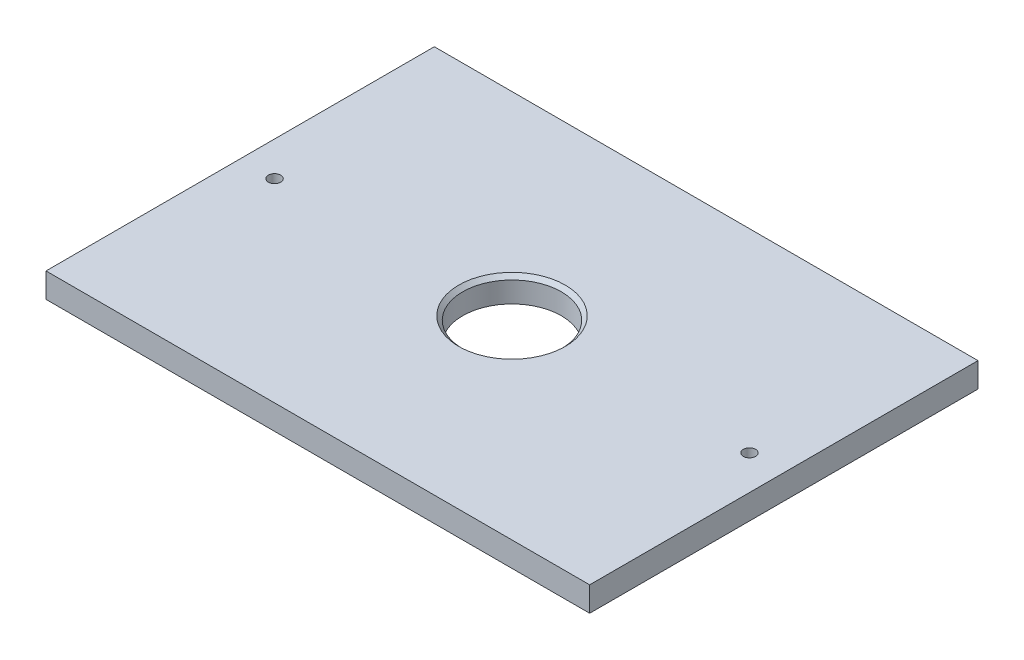
ISO-10303-21;
HEADER;
FILE_DESCRIPTION(('STEP AP214'),'2;1');
FILE_NAME('part.step','',(''),(''),'','','');
FILE_SCHEMA(('AUTOMOTIVE_DESIGN { 1 0 10303 214 1 1 1 1 }'));
ENDSEC;
DATA;
#1=APPLICATION_CONTEXT('core data for automotive mechanical design processes');
#2=APPLICATION_PROTOCOL_DEFINITION('international standard','automotive_design',2000,#1);
#3=PRODUCT_CONTEXT('',#1,'mechanical');
#4=PRODUCT('Part','Part','',(#3));
#5=PRODUCT_RELATED_PRODUCT_CATEGORY('part','',(#4));
#6=PRODUCT_DEFINITION_FORMATION('','',#4);
#7=PRODUCT_DEFINITION_CONTEXT('part definition',#1,'design');
#8=PRODUCT_DEFINITION('design','',#6,#7);
#9=PRODUCT_DEFINITION_SHAPE('','',#8);
#10=(LENGTH_UNIT() NAMED_UNIT(*) SI_UNIT(.MILLI.,.METRE.));
#11=(NAMED_UNIT(*) PLANE_ANGLE_UNIT() SI_UNIT($,.RADIAN.));
#12=(NAMED_UNIT(*) SI_UNIT($,.STERADIAN.) SOLID_ANGLE_UNIT());
#13=UNCERTAINTY_MEASURE_WITH_UNIT(LENGTH_MEASURE(1.E-05),#10,'distance_accuracy_value','');
#14=(GEOMETRIC_REPRESENTATION_CONTEXT(3) GLOBAL_UNCERTAINTY_ASSIGNED_CONTEXT((#13)) GLOBAL_UNIT_ASSIGNED_CONTEXT((#10,
#11,#12)) REPRESENTATION_CONTEXT('',''));
#15=CARTESIAN_POINT('',(0.,0.,0.));
#16=DIRECTION('',(0.,0.,1.));
#17=DIRECTION('',(1.,0.,0.));
#18=AXIS2_PLACEMENT_3D('',#15,#16,#17);
#19=CARTESIAN_POINT('',(0.,6.35,0.));
#20=DIRECTION('',(1.,0.,0.));
#21=DIRECTION('',(0.,0.,-1.));
#22=AXIS2_PLACEMENT_3D('',#19,#20,#21);
#23=PLANE('',#22);
#24=DIRECTION('',(0.,0.,1.));
#25=VECTOR('',#24,1.);
#26=CARTESIAN_POINT('',(0.,0.,0.));
#27=LINE('',#26,#25);
#28=CARTESIAN_POINT('',(0.,0.,-100.));
#29=VERTEX_POINT('',#28);
#30=CARTESIAN_POINT('',(0.,0.,0.));
#31=VERTEX_POINT('',#30);
#32=EDGE_CURVE('E102',#29,#31,#27,.T.);
#33=ORIENTED_EDGE('',*,*,#32,.T.);
#34=DIRECTION('',(0.,-1.,0.));
#35=VECTOR('',#34,1.);
#36=CARTESIAN_POINT('',(0.,6.35,0.));
#37=LINE('',#36,#35);
#38=CARTESIAN_POINT('',(0.,6.35,0.));
#39=VERTEX_POINT('',#38);
#40=EDGE_CURVE('E93',#39,#31,#37,.T.);
#41=ORIENTED_EDGE('',*,*,#40,.F.);
#42=DIRECTION('',(0.,0.,1.));
#43=VECTOR('',#42,1.);
#44=CARTESIAN_POINT('',(0.,6.35,0.));
#45=LINE('',#44,#43);
#46=CARTESIAN_POINT('',(0.,6.35,-100.));
#47=VERTEX_POINT('',#46);
#48=EDGE_CURVE('E87',#47,#39,#45,.T.);
#49=ORIENTED_EDGE('',*,*,#48,.F.);
#50=DIRECTION('',(0.,-1.,0.));
#51=VECTOR('',#50,1.);
#52=CARTESIAN_POINT('',(0.,6.35,-100.));
#53=LINE('',#52,#51);
#54=EDGE_CURVE('E98',#47,#29,#53,.T.);
#55=ORIENTED_EDGE('',*,*,#54,.T.);
#56=EDGE_LOOP('',(#33,#41,#49,#55));
#57=FACE_BOUND('',#56,.T.);
#58=ADVANCED_FACE('F34',(#57),#23,.F.);
#59=CARTESIAN_POINT('',(0.,6.35,0.));
#60=DIRECTION('',(0.,0.,-1.));
#61=DIRECTION('',(-1.,0.,0.));
#62=AXIS2_PLACEMENT_3D('',#59,#60,#61);
#63=PLANE('',#62);
#64=DIRECTION('',(1.,0.,0.));
#65=VECTOR('',#64,1.);
#66=CARTESIAN_POINT('',(0.,0.,0.));
#67=LINE('',#66,#65);
#68=CARTESIAN_POINT('',(140.,0.,0.));
#69=VERTEX_POINT('',#68);
#70=EDGE_CURVE('E92',#31,#69,#67,.T.);
#71=ORIENTED_EDGE('',*,*,#70,.T.);
#72=DIRECTION('',(0.,-1.,0.));
#73=VECTOR('',#72,1.);
#74=CARTESIAN_POINT('',(140.,6.35,0.));
#75=LINE('',#74,#73);
#76=CARTESIAN_POINT('',(140.,6.35,0.));
#77=VERTEX_POINT('',#76);
#78=EDGE_CURVE('E90',#77,#69,#75,.T.);
#79=ORIENTED_EDGE('',*,*,#78,.F.);
#80=DIRECTION('',(1.,0.,0.));
#81=VECTOR('',#80,1.);
#82=CARTESIAN_POINT('',(0.,6.35,0.));
#83=LINE('',#82,#81);
#84=EDGE_CURVE('E82',#39,#77,#83,.T.);
#85=ORIENTED_EDGE('',*,*,#84,.F.);
#86=ORIENTED_EDGE('',*,*,#40,.T.);
#87=EDGE_LOOP('',(#71,#79,#85,#86));
#88=FACE_BOUND('',#87,.T.);
#89=ADVANCED_FACE('F91',(#88),#63,.F.);
#90=CARTESIAN_POINT('',(140.,6.35,0.));
#91=DIRECTION('',(-1.,0.,0.));
#92=DIRECTION('',(0.,0.,1.));
#93=AXIS2_PLACEMENT_3D('',#90,#91,#92);
#94=PLANE('',#93);
#95=DIRECTION('',(0.,0.,-1.));
#96=VECTOR('',#95,1.);
#97=CARTESIAN_POINT('',(140.,0.,0.));
#98=LINE('',#97,#96);
#99=CARTESIAN_POINT('',(140.,0.,-100.));
#100=VERTEX_POINT('',#99);
#101=EDGE_CURVE('E68',#69,#100,#98,.T.);
#102=ORIENTED_EDGE('',*,*,#101,.T.);
#103=DIRECTION('',(0.,-1.,0.));
#104=VECTOR('',#103,1.);
#105=CARTESIAN_POINT('',(140.,6.35,-100.));
#106=LINE('',#105,#104);
#107=CARTESIAN_POINT('',(140.,6.35,-100.));
#108=VERTEX_POINT('',#107);
#109=EDGE_CURVE('E94',#108,#100,#106,.T.);
#110=ORIENTED_EDGE('',*,*,#109,.F.);
#111=DIRECTION('',(0.,0.,-1.));
#112=VECTOR('',#111,1.);
#113=CARTESIAN_POINT('',(140.,6.35,0.));
#114=LINE('',#113,#112);
#115=EDGE_CURVE('E85',#77,#108,#114,.T.);
#116=ORIENTED_EDGE('',*,*,#115,.F.);
#117=ORIENTED_EDGE('',*,*,#78,.T.);
#118=EDGE_LOOP('',(#102,#110,#116,#117));
#119=FACE_BOUND('',#118,.T.);
#120=ADVANCED_FACE('F96',(#119),#94,.F.);
#121=CARTESIAN_POINT('',(0.,6.35,-100.));
#122=DIRECTION('',(0.,0.,1.));
#123=DIRECTION('',(1.,0.,0.));
#124=AXIS2_PLACEMENT_3D('',#121,#122,#123);
#125=PLANE('',#124);
#126=DIRECTION('',(-1.,0.,0.));
#127=VECTOR('',#126,1.);
#128=CARTESIAN_POINT('',(0.,0.,-100.));
#129=LINE('',#128,#127);
#130=EDGE_CURVE('E74',#100,#29,#129,.T.);
#131=ORIENTED_EDGE('',*,*,#130,.T.);
#132=ORIENTED_EDGE('',*,*,#54,.F.);
#133=DIRECTION('',(-1.,0.,0.));
#134=VECTOR('',#133,1.);
#135=CARTESIAN_POINT('',(0.,6.35,-100.));
#136=LINE('',#135,#134);
#137=EDGE_CURVE('E51',#108,#47,#136,.T.);
#138=ORIENTED_EDGE('',*,*,#137,.F.);
#139=ORIENTED_EDGE('',*,*,#109,.T.);
#140=EDGE_LOOP('',(#131,#132,#138,#139));
#141=FACE_BOUND('',#140,.T.);
#142=ADVANCED_FACE('F145',(#141),#125,.F.);
#143=CARTESIAN_POINT('',(0.,6.35,0.));
#144=DIRECTION('',(0.,-1.,0.));
#145=DIRECTION('',(0.,0.,-1.));
#146=AXIS2_PLACEMENT_3D('',#143,#144,#145);
#147=PLANE('',#146);
#148=CARTESIAN_POINT('',(70.,6.35,-50.));
#149=DIRECTION('',(0.,-1.,0.));
#150=DIRECTION('',(0.,0.,-1.));
#151=AXIS2_PLACEMENT_3D('',#148,#149,#150);
#152=CIRCLE('',#151,13.705);
#153=CARTESIAN_POINT('',(70.,6.35,-63.705));
#154=VERTEX_POINT('',#153);
#155=EDGE_CURVE('E11',#154,#154,#152,.T.);
#156=ORIENTED_EDGE('',*,*,#155,.T.);
#157=EDGE_LOOP('',(#156));
#158=FACE_BOUND('',#157,.T.);
#159=CARTESIAN_POINT('',(8.85,6.35,-50.));
#160=DIRECTION('',(0.,1.,0.));
#161=DIRECTION('',(0.,0.,1.));
#162=AXIS2_PLACEMENT_3D('',#159,#160,#161);
#163=CIRCLE('',#162,1.5875);
#164=CARTESIAN_POINT('',(8.85,6.35,-48.4125));
#165=VERTEX_POINT('',#164);
#166=EDGE_CURVE('E118',#165,#165,#163,.T.);
#167=ORIENTED_EDGE('',*,*,#166,.F.);
#168=EDGE_LOOP('',(#167));
#169=FACE_BOUND('',#168,.T.);
#170=CARTESIAN_POINT('',(131.15,6.35,-50.));
#171=DIRECTION('',(0.,1.,0.));
#172=DIRECTION('',(0.,0.,1.));
#173=AXIS2_PLACEMENT_3D('',#170,#171,#172);
#174=CIRCLE('',#173,1.58749999999999);
#175=CARTESIAN_POINT('',(131.15,6.35,-48.4125));
#176=VERTEX_POINT('',#175);
#177=EDGE_CURVE('E165',#176,#176,#174,.T.);
#178=ORIENTED_EDGE('',*,*,#177,.F.);
#179=EDGE_LOOP('',(#178));
#180=FACE_BOUND('',#179,.T.);
#181=ORIENTED_EDGE('',*,*,#48,.T.);
#182=ORIENTED_EDGE('',*,*,#84,.T.);
#183=ORIENTED_EDGE('',*,*,#115,.T.);
#184=ORIENTED_EDGE('',*,*,#137,.T.);
#185=EDGE_LOOP('',(#181,#182,#183,#184));
#186=FACE_BOUND('',#185,.T.);
#187=ADVANCED_FACE('F83',(#158,#169,#180,#186),#147,.F.);
#188=CARTESIAN_POINT('',(0.,0.,0.));
#189=DIRECTION('',(0.,-1.,0.));
#190=DIRECTION('',(0.,0.,-1.));
#191=AXIS2_PLACEMENT_3D('',#188,#189,#190);
#192=PLANE('',#191);
#193=CARTESIAN_POINT('',(8.85,0.,-50.));
#194=DIRECTION('',(0.,-1.,0.));
#195=DIRECTION('',(0.,0.,-1.));
#196=AXIS2_PLACEMENT_3D('',#193,#194,#195);
#197=CIRCLE('',#196,1.5875);
#198=CARTESIAN_POINT('',(8.85,0.,-51.5875));
#199=VERTEX_POINT('',#198);
#200=EDGE_CURVE('E114',#199,#199,#197,.T.);
#201=ORIENTED_EDGE('',*,*,#200,.F.);
#202=EDGE_LOOP('',(#201));
#203=FACE_BOUND('',#202,.T.);
#204=CARTESIAN_POINT('',(131.15,0.,-50.));
#205=DIRECTION('',(0.,-1.,0.));
#206=DIRECTION('',(0.,0.,-1.));
#207=AXIS2_PLACEMENT_3D('',#204,#205,#206);
#208=CIRCLE('',#207,1.58749999999999);
#209=CARTESIAN_POINT('',(131.15,0.,-51.5875));
#210=VERTEX_POINT('',#209);
#211=EDGE_CURVE('E115',#210,#210,#208,.T.);
#212=ORIENTED_EDGE('',*,*,#211,.F.);
#213=EDGE_LOOP('',(#212));
#214=FACE_BOUND('',#213,.T.);
#215=CARTESIAN_POINT('',(70.,0.,-50.));
#216=DIRECTION('',(0.,-1.,0.));
#217=DIRECTION('',(0.,0.,-1.));
#218=AXIS2_PLACEMENT_3D('',#215,#216,#217);
#219=CIRCLE('',#218,12.705);
#220=CARTESIAN_POINT('',(70.,0.,-62.705));
#221=VERTEX_POINT('',#220);
#222=EDGE_CURVE('E105',#221,#221,#219,.T.);
#223=ORIENTED_EDGE('',*,*,#222,.F.);
#224=EDGE_LOOP('',(#223));
#225=FACE_BOUND('',#224,.T.);
#226=ORIENTED_EDGE('',*,*,#32,.F.);
#227=ORIENTED_EDGE('',*,*,#130,.F.);
#228=ORIENTED_EDGE('',*,*,#101,.F.);
#229=ORIENTED_EDGE('',*,*,#70,.F.);
#230=EDGE_LOOP('',(#226,#227,#228,#229));
#231=FACE_BOUND('',#230,.T.);
#232=ADVANCED_FACE('F148',(#203,#214,#225,#231),#192,.T.);
#233=CARTESIAN_POINT('',(70.,-3.65,-50.));
#234=DIRECTION('',(0.,1.,0.));
#235=DIRECTION('',(0.,0.,1.));
#236=AXIS2_PLACEMENT_3D('',#233,#234,#235);
#237=CYLINDRICAL_SURFACE('',#236,12.705);
#238=CARTESIAN_POINT('',(70.,5.35000000000003,-50.));
#239=DIRECTION('',(0.,-1.,0.));
#240=DIRECTION('',(0.,0.,-1.));
#241=AXIS2_PLACEMENT_3D('',#238,#239,#240);
#242=CIRCLE('',#241,12.705);
#243=CARTESIAN_POINT('',(70.,5.35000000000003,-62.705));
#244=VERTEX_POINT('',#243);
#245=EDGE_CURVE('E43',#244,#244,#242,.F.);
#246=ORIENTED_EDGE('',*,*,#245,.T.);
#247=EDGE_LOOP('',(#246));
#248=FACE_BOUND('',#247,.T.);
#249=ORIENTED_EDGE('',*,*,#222,.T.);
#250=EDGE_LOOP('',(#249));
#251=FACE_BOUND('',#250,.T.);
#252=ADVANCED_FACE('F123',(#248,#251),#237,.F.);
#253=CARTESIAN_POINT('',(131.15,-3.65,-50.));
#254=DIRECTION('',(0.,1.,0.));
#255=DIRECTION('',(0.,0.,1.));
#256=AXIS2_PLACEMENT_3D('',#253,#254,#255);
#257=CYLINDRICAL_SURFACE('',#256,1.58749999999999);
#258=ORIENTED_EDGE('',*,*,#211,.T.);
#259=EDGE_LOOP('',(#258));
#260=FACE_BOUND('',#259,.T.);
#261=ORIENTED_EDGE('',*,*,#177,.T.);
#262=EDGE_LOOP('',(#261));
#263=FACE_BOUND('',#262,.T.);
#264=ADVANCED_FACE('F132',(#260,#263),#257,.F.);
#265=CARTESIAN_POINT('',(8.85,-3.65,-50.));
#266=DIRECTION('',(0.,1.,0.));
#267=DIRECTION('',(0.,0.,1.));
#268=AXIS2_PLACEMENT_3D('',#265,#266,#267);
#269=CYLINDRICAL_SURFACE('',#268,1.5875);
#270=ORIENTED_EDGE('',*,*,#200,.T.);
#271=EDGE_LOOP('',(#270));
#272=FACE_BOUND('',#271,.T.);
#273=ORIENTED_EDGE('',*,*,#166,.T.);
#274=EDGE_LOOP('',(#273));
#275=FACE_BOUND('',#274,.T.);
#276=ADVANCED_FACE('F127',(#272,#275),#269,.F.);
#277=CARTESIAN_POINT('',(70.,5.35000000000003,-50.));
#278=DIRECTION('',(0.,1.,0.));
#279=DIRECTION('',(0.,0.,1.));
#280=AXIS2_PLACEMENT_3D('',#277,#278,#279);
#281=CONICAL_SURFACE('',#280,12.705,0.785398163397458);
#282=ORIENTED_EDGE('',*,*,#155,.F.);
#283=EDGE_LOOP('',(#282));
#284=FACE_BOUND('',#283,.T.);
#285=ORIENTED_EDGE('',*,*,#245,.F.);
#286=EDGE_LOOP('',(#285));
#287=FACE_BOUND('',#286,.T.);
#288=ADVANCED_FACE('F36',(#284,#287),#281,.F.);
#289=CLOSED_SHELL('',(#58,#89,#120,#142,#187,#232,#252,#264,#276,#288));
#290=MANIFOLD_SOLID_BREP('B2',#289);
#291=ADVANCED_BREP_SHAPE_REPRESENTATION('',(#18,#290),#14);
#292=SHAPE_DEFINITION_REPRESENTATION(#9,#291);
ENDSEC;
END-ISO-10303-21;
